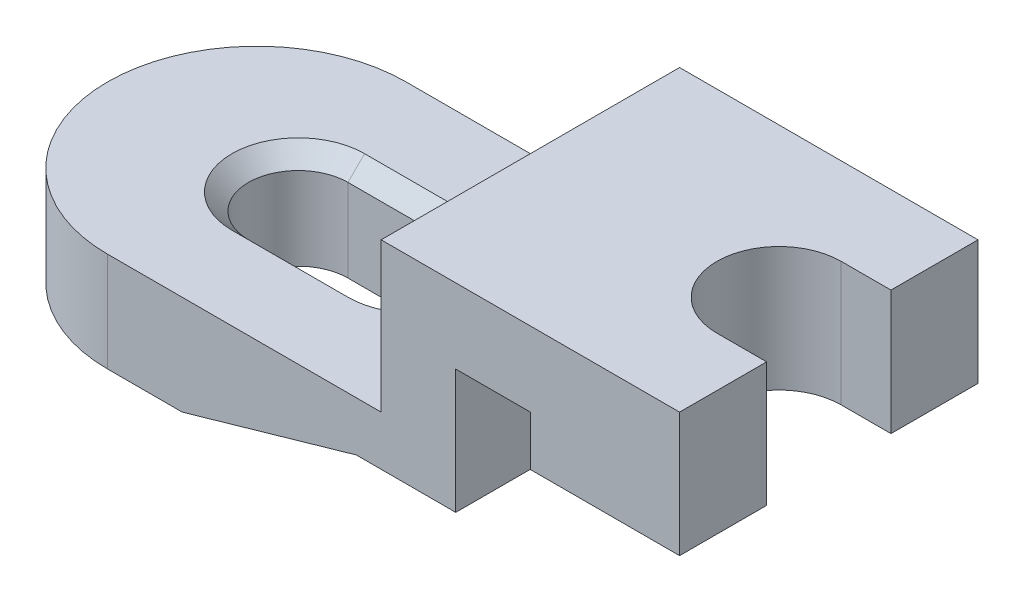
ISO-10303-21;
HEADER;
FILE_DESCRIPTION(('STEP AP214'),'2;1');
FILE_NAME('part.step','',(''),(''),'','','');
FILE_SCHEMA(('AUTOMOTIVE_DESIGN { 1 0 10303 214 1 1 1 1 }'));
ENDSEC;
DATA;
#1=APPLICATION_CONTEXT('core data for automotive mechanical design processes');
#2=APPLICATION_PROTOCOL_DEFINITION('international standard','automotive_design',2000,#1);
#3=PRODUCT_CONTEXT('',#1,'mechanical');
#4=PRODUCT('Part','Part','',(#3));
#5=PRODUCT_RELATED_PRODUCT_CATEGORY('part','',(#4));
#6=PRODUCT_DEFINITION_FORMATION('','',#4);
#7=PRODUCT_DEFINITION_CONTEXT('part definition',#1,'design');
#8=PRODUCT_DEFINITION('design','',#6,#7);
#9=PRODUCT_DEFINITION_SHAPE('','',#8);
#10=(LENGTH_UNIT() NAMED_UNIT(*) SI_UNIT(.MILLI.,.METRE.));
#11=(NAMED_UNIT(*) PLANE_ANGLE_UNIT() SI_UNIT($,.RADIAN.));
#12=(NAMED_UNIT(*) SI_UNIT($,.STERADIAN.) SOLID_ANGLE_UNIT());
#13=UNCERTAINTY_MEASURE_WITH_UNIT(LENGTH_MEASURE(1.E-05),#10,'distance_accuracy_value','');
#14=(GEOMETRIC_REPRESENTATION_CONTEXT(3) GLOBAL_UNCERTAINTY_ASSIGNED_CONTEXT((#13)) GLOBAL_UNIT_ASSIGNED_CONTEXT((#10,
#11,#12)) REPRESENTATION_CONTEXT('',''));
#15=CARTESIAN_POINT('',(0.,0.,0.));
#16=DIRECTION('',(0.,0.,1.));
#17=DIRECTION('',(1.,0.,0.));
#18=AXIS2_PLACEMENT_3D('',#15,#16,#17);
#19=CARTESIAN_POINT('',(60.,15.,18.));
#20=DIRECTION('',(-1.,0.,0.));
#21=DIRECTION('',(0.,0.,1.));
#22=AXIS2_PLACEMENT_3D('',#19,#20,#21);
#23=PLANE('',#22);
#24=DIRECTION('',(0.,0.,-1.));
#25=VECTOR('',#24,1.);
#26=CARTESIAN_POINT('',(60.,30.,18.));
#27=LINE('',#26,#25);
#28=CARTESIAN_POINT('',(60.,30.,-7.5));
#29=VERTEX_POINT('',#28);
#30=CARTESIAN_POINT('',(60.,30.,-18.));
#31=VERTEX_POINT('',#30);
#32=EDGE_CURVE('E308',#29,#31,#27,.T.);
#33=ORIENTED_EDGE('',*,*,#32,.F.);
#34=DIRECTION('',(0.,-1.,0.));
#35=VECTOR('',#34,1.);
#36=CARTESIAN_POINT('',(60.,15.,-7.5));
#37=LINE('',#36,#35);
#38=CARTESIAN_POINT('',(60.,15.,-7.5));
#39=VERTEX_POINT('',#38);
#40=EDGE_CURVE('E215',#29,#39,#37,.T.);
#41=ORIENTED_EDGE('',*,*,#40,.T.);
#42=DIRECTION('',(0.,0.,-1.));
#43=VECTOR('',#42,1.);
#44=CARTESIAN_POINT('',(60.,15.,18.));
#45=LINE('',#44,#43);
#46=CARTESIAN_POINT('',(60.,15.,-18.));
#47=VERTEX_POINT('',#46);
#48=EDGE_CURVE('E311',#39,#47,#45,.T.);
#49=ORIENTED_EDGE('',*,*,#48,.T.);
#50=DIRECTION('',(0.,1.,0.));
#51=VECTOR('',#50,1.);
#52=CARTESIAN_POINT('',(60.,15.,-18.));
#53=LINE('',#52,#51);
#54=EDGE_CURVE('E297',#47,#31,#53,.T.);
#55=ORIENTED_EDGE('',*,*,#54,.T.);
#56=EDGE_LOOP('',(#33,#41,#49,#55));
#57=FACE_BOUND('',#56,.T.);
#58=ADVANCED_FACE('F48',(#57),#23,.F.);
#59=CARTESIAN_POINT('',(24.,12.,7.99999999999999));
#60=DIRECTION('',(0.,-0.707106781186547,0.707106781186548));
#61=DIRECTION('',(-1.,0.,0.));
#62=AXIS2_PLACEMENT_3D('',#59,#60,#61);
#63=PLANE('',#62);
#64=DIRECTION('',(0.,-0.707106781186548,-0.707106781186547));
#65=VECTOR('',#64,1.);
#66=CARTESIAN_POINT('',(-3.99999999999999,12.,8.));
#67=LINE('',#66,#65);
#68=CARTESIAN_POINT('',(-3.99999999999999,12.,8.));
#69=VERTEX_POINT('',#68);
#70=CARTESIAN_POINT('',(-3.99999999999999,10.,6.));
#71=VERTEX_POINT('',#70);
#72=EDGE_CURVE('E56',#69,#71,#67,.T.);
#73=ORIENTED_EDGE('',*,*,#72,.F.);
#74=DIRECTION('',(-1.,0.,0.));
#75=VECTOR('',#74,1.);
#76=CARTESIAN_POINT('',(24.,12.,7.99999999999999));
#77=LINE('',#76,#75);
#78=CARTESIAN_POINT('',(10.,12.,8.));
#79=VERTEX_POINT('',#78);
#80=EDGE_CURVE('E356',#79,#69,#77,.T.);
#81=ORIENTED_EDGE('',*,*,#80,.F.);
#82=DIRECTION('',(0.,0.707106781186548,0.707106781186546));
#83=VECTOR('',#82,1.);
#84=CARTESIAN_POINT('',(10.,12.,7.99999999999999));
#85=LINE('',#84,#83);
#86=CARTESIAN_POINT('',(10.,10.,6.));
#87=VERTEX_POINT('',#86);
#88=EDGE_CURVE('E71',#79,#87,#85,.F.);
#89=ORIENTED_EDGE('',*,*,#88,.T.);
#90=DIRECTION('',(1.,0.,0.));
#91=VECTOR('',#90,1.);
#92=CARTESIAN_POINT('',(10.,10.,6.));
#93=LINE('',#92,#91);
#94=EDGE_CURVE('E377',#71,#87,#93,.T.);
#95=ORIENTED_EDGE('',*,*,#94,.F.);
#96=EDGE_LOOP('',(#73,#81,#89,#95));
#97=FACE_BOUND('',#96,.T.);
#98=ADVANCED_FACE('F50',(#97),#63,.F.);
#99=CARTESIAN_POINT('',(10.,12.,0.));
#100=DIRECTION('',(0.,1.,0.));
#101=DIRECTION('',(0.,0.,1.));
#102=AXIS2_PLACEMENT_3D('',#99,#100,#101);
#103=CONICAL_SURFACE('',#102,7.99999999999999,0.785398163397447);
#104=ORIENTED_EDGE('',*,*,#88,.F.);
#105=CARTESIAN_POINT('',(10.,12.,0.));
#106=DIRECTION('',(0.,-1.,0.));
#107=DIRECTION('',(1.,0.,0.));
#108=AXIS2_PLACEMENT_3D('',#105,#106,#107);
#109=CIRCLE('',#108,7.99999999999999);
#110=CARTESIAN_POINT('',(10.,12.,-8.));
#111=VERTEX_POINT('',#110);
#112=EDGE_CURVE('E359',#111,#79,#109,.T.);
#113=ORIENTED_EDGE('',*,*,#112,.F.);
#114=DIRECTION('',(0.,-0.707106781186548,0.707106781186547));
#115=VECTOR('',#114,1.);
#116=CARTESIAN_POINT('',(10.,12.,-7.99999999999999));
#117=LINE('',#116,#115);
#118=CARTESIAN_POINT('',(10.,10.,-6.));
#119=VERTEX_POINT('',#118);
#120=EDGE_CURVE('E381',#111,#119,#117,.T.);
#121=ORIENTED_EDGE('',*,*,#120,.T.);
#122=CARTESIAN_POINT('',(10.,10.,0.));
#123=DIRECTION('',(0.,-1.,0.));
#124=DIRECTION('',(0.,0.,-1.));
#125=AXIS2_PLACEMENT_3D('',#122,#123,#124);
#126=CIRCLE('',#125,6.);
#127=EDGE_CURVE('E374',#87,#119,#126,.F.);
#128=ORIENTED_EDGE('',*,*,#127,.F.);
#129=EDGE_LOOP('',(#104,#113,#121,#128));
#130=FACE_BOUND('',#129,.T.);
#131=ADVANCED_FACE('F474',(#130),#103,.F.);
#132=CARTESIAN_POINT('',(24.,12.,-8.));
#133=DIRECTION('',(0.,-0.707106781186547,-0.707106781186548));
#134=DIRECTION('',(1.,0.,0.));
#135=AXIS2_PLACEMENT_3D('',#132,#133,#134);
#136=PLANE('',#135);
#137=ORIENTED_EDGE('',*,*,#120,.F.);
#138=DIRECTION('',(1.,0.,0.));
#139=VECTOR('',#138,1.);
#140=CARTESIAN_POINT('',(24.,12.,-8.));
#141=LINE('',#140,#139);
#142=CARTESIAN_POINT('',(-3.99999999999999,12.,-7.99999999999999));
#143=VERTEX_POINT('',#142);
#144=EDGE_CURVE('E362',#143,#111,#141,.T.);
#145=ORIENTED_EDGE('',*,*,#144,.F.);
#146=DIRECTION('',(0.,0.707106781186548,-0.707106781186546));
#147=VECTOR('',#146,1.);
#148=CARTESIAN_POINT('',(-3.99999999999999,12.,-7.99999999999999));
#149=LINE('',#148,#147);
#150=CARTESIAN_POINT('',(-3.99999999999999,10.,-5.99999999999999));
#151=VERTEX_POINT('',#150);
#152=EDGE_CURVE('E379',#143,#151,#149,.F.);
#153=ORIENTED_EDGE('',*,*,#152,.T.);
#154=DIRECTION('',(-1.,0.,0.));
#155=VECTOR('',#154,1.);
#156=CARTESIAN_POINT('',(10.,10.,-6.));
#157=LINE('',#156,#155);
#158=EDGE_CURVE('E371',#119,#151,#157,.T.);
#159=ORIENTED_EDGE('',*,*,#158,.F.);
#160=EDGE_LOOP('',(#137,#145,#153,#159));
#161=FACE_BOUND('',#160,.T.);
#162=ADVANCED_FACE('F506',(#161),#136,.F.);
#163=CARTESIAN_POINT('',(-3.99999999999999,12.,0.));
#164=DIRECTION('',(0.,1.,0.));
#165=DIRECTION('',(-1.,0.,0.));
#166=AXIS2_PLACEMENT_3D('',#163,#164,#165);
#167=CONICAL_SURFACE('',#166,7.99999999999999,0.785398163397447);
#168=CARTESIAN_POINT('',(-3.99999999999999,12.,0.));
#169=DIRECTION('',(0.,-1.,0.));
#170=DIRECTION('',(1.,0.,0.));
#171=AXIS2_PLACEMENT_3D('',#168,#169,#170);
#172=CIRCLE('',#171,7.99999999999999);
#173=EDGE_CURVE('E365',#69,#143,#172,.T.);
#174=ORIENTED_EDGE('',*,*,#173,.F.);
#175=ORIENTED_EDGE('',*,*,#72,.T.);
#176=CARTESIAN_POINT('',(-3.99999999999999,9.99999999999999,0.));
#177=DIRECTION('',(0.,-1.,0.));
#178=DIRECTION('',(1.,0.,0.));
#179=AXIS2_PLACEMENT_3D('',#176,#177,#178);
#180=CIRCLE('',#179,6.);
#181=EDGE_CURVE('E368',#151,#71,#180,.F.);
#182=ORIENTED_EDGE('',*,*,#181,.F.);
#183=ORIENTED_EDGE('',*,*,#152,.F.);
#184=EDGE_LOOP('',(#174,#175,#182,#183));
#185=FACE_BOUND('',#184,.T.);
#186=ADVANCED_FACE('F386',(#185),#167,.F.);
#187=CARTESIAN_POINT('',(-8.99999999999999,12.,0.));
#188=DIRECTION('',(0.,-1.,0.));
#189=DIRECTION('',(0.,0.,-1.));
#190=AXIS2_PLACEMENT_3D('',#187,#188,#189);
#191=CYLINDRICAL_SURFACE('',#190,18.);
#192=DIRECTION('',(0.,1.,0.));
#193=VECTOR('',#192,1.);
#194=CARTESIAN_POINT('',(-8.99999999999999,12.,18.));
#195=LINE('',#194,#193);
#196=CARTESIAN_POINT('',(-8.99999999999999,12.,18.));
#197=VERTEX_POINT('',#196);
#198=CARTESIAN_POINT('',(-9.,0.,18.));
#199=VERTEX_POINT('',#198);
#200=EDGE_CURVE('E334',#197,#199,#195,.F.);
#201=ORIENTED_EDGE('',*,*,#200,.F.);
#202=CARTESIAN_POINT('',(-8.99999999999999,12.,0.));
#203=DIRECTION('',(0.,-1.,0.));
#204=DIRECTION('',(1.,0.,0.));
#205=AXIS2_PLACEMENT_3D('',#202,#203,#204);
#206=CIRCLE('',#205,18.);
#207=CARTESIAN_POINT('',(-8.99999999999999,12.,-18.));
#208=VERTEX_POINT('',#207);
#209=EDGE_CURVE('E340',#208,#197,#206,.F.);
#210=ORIENTED_EDGE('',*,*,#209,.F.);
#211=DIRECTION('',(0.,-1.,0.));
#212=VECTOR('',#211,1.);
#213=CARTESIAN_POINT('',(-8.99999999999999,0.,-18.));
#214=LINE('',#213,#212);
#215=CARTESIAN_POINT('',(-9.,0.,-18.));
#216=VERTEX_POINT('',#215);
#217=EDGE_CURVE('E337',#216,#208,#214,.F.);
#218=ORIENTED_EDGE('',*,*,#217,.F.);
#219=CARTESIAN_POINT('',(-8.99999999999999,0.,0.));
#220=DIRECTION('',(0.,1.,0.));
#221=DIRECTION('',(0.,0.,1.));
#222=AXIS2_PLACEMENT_3D('',#219,#220,#221);
#223=CIRCLE('',#222,18.);
#224=EDGE_CURVE('E342',#199,#216,#223,.F.);
#225=ORIENTED_EDGE('',*,*,#224,.F.);
#226=EDGE_LOOP('',(#201,#210,#218,#225));
#227=FACE_BOUND('',#226,.T.);
#228=ADVANCED_FACE('F413',(#227),#191,.T.);
#229=CARTESIAN_POINT('',(24.,12.,18.));
#230=DIRECTION('',(0.,-1.,0.));
#231=DIRECTION('',(1.,0.,0.));
#232=AXIS2_PLACEMENT_3D('',#229,#230,#231);
#233=PLANE('',#232);
#234=ORIENTED_EDGE('',*,*,#80,.T.);
#235=ORIENTED_EDGE('',*,*,#173,.T.);
#236=ORIENTED_EDGE('',*,*,#144,.T.);
#237=ORIENTED_EDGE('',*,*,#112,.T.);
#238=EDGE_LOOP('',(#234,#235,#236,#237));
#239=FACE_BOUND('',#238,.T.);
#240=DIRECTION('',(-1.,0.,0.));
#241=VECTOR('',#240,1.);
#242=CARTESIAN_POINT('',(24.,12.,-18.));
#243=LINE('',#242,#241);
#244=CARTESIAN_POINT('',(24.,12.,-18.));
#245=VERTEX_POINT('',#244);
#246=EDGE_CURVE('E253',#245,#208,#243,.T.);
#247=ORIENTED_EDGE('',*,*,#246,.T.);
#248=ORIENTED_EDGE('',*,*,#209,.T.);
#249=DIRECTION('',(-1.,0.,0.));
#250=VECTOR('',#249,1.);
#251=CARTESIAN_POINT('',(24.,12.,18.));
#252=LINE('',#251,#250);
#253=CARTESIAN_POINT('',(24.,12.,18.));
#254=VERTEX_POINT('',#253);
#255=EDGE_CURVE('E254',#254,#197,#252,.T.);
#256=ORIENTED_EDGE('',*,*,#255,.F.);
#257=DIRECTION('',(0.,0.,-1.));
#258=VECTOR('',#257,1.);
#259=CARTESIAN_POINT('',(24.,12.,18.));
#260=LINE('',#259,#258);
#261=EDGE_CURVE('E278',#254,#245,#260,.T.);
#262=ORIENTED_EDGE('',*,*,#261,.T.);
#263=EDGE_LOOP('',(#247,#248,#256,#262));
#264=FACE_BOUND('',#263,.T.);
#265=ADVANCED_FACE('F455',(#239,#264),#233,.F.);
#266=CARTESIAN_POINT('',(-27.,0.,18.));
#267=DIRECTION('',(0.,1.,0.));
#268=DIRECTION('',(0.,0.,1.));
#269=AXIS2_PLACEMENT_3D('',#266,#267,#268);
#270=PLANE('',#269);
#271=CARTESIAN_POINT('',(-3.99999999999999,0.,0.));
#272=DIRECTION('',(0.,1.,0.));
#273=DIRECTION('',(0.,0.,1.));
#274=AXIS2_PLACEMENT_3D('',#271,#272,#273);
#275=CIRCLE('',#274,6.);
#276=CARTESIAN_POINT('',(-3.99999999999999,0.,-5.99999999999999));
#277=VERTEX_POINT('',#276);
#278=CARTESIAN_POINT('',(-3.99999999999999,0.,6.));
#279=VERTEX_POINT('',#278);
#280=EDGE_CURVE('E353',#277,#279,#275,.T.);
#281=ORIENTED_EDGE('',*,*,#280,.T.);
#282=DIRECTION('',(1.,0.,0.));
#283=VECTOR('',#282,1.);
#284=CARTESIAN_POINT('',(-27.,0.,6.00000000000001));
#285=LINE('',#284,#283);
#286=CARTESIAN_POINT('',(0.,0.,6.));
#287=VERTEX_POINT('',#286);
#288=EDGE_CURVE('E250',#279,#287,#285,.T.);
#289=ORIENTED_EDGE('',*,*,#288,.T.);
#290=DIRECTION('',(0.,0.,-1.));
#291=VECTOR('',#290,1.);
#292=CARTESIAN_POINT('',(0.,0.,18.));
#293=LINE('',#292,#291);
#294=CARTESIAN_POINT('',(0.,0.,18.));
#295=VERTEX_POINT('',#294);
#296=EDGE_CURVE('E331',#295,#287,#293,.T.);
#297=ORIENTED_EDGE('',*,*,#296,.F.);
#298=DIRECTION('',(1.,0.,0.));
#299=VECTOR('',#298,1.);
#300=CARTESIAN_POINT('',(-27.,0.,18.));
#301=LINE('',#300,#299);
#302=EDGE_CURVE('E257',#199,#295,#301,.T.);
#303=ORIENTED_EDGE('',*,*,#302,.F.);
#304=ORIENTED_EDGE('',*,*,#224,.T.);
#305=DIRECTION('',(1.,0.,0.));
#306=VECTOR('',#305,1.);
#307=CARTESIAN_POINT('',(-27.,0.,-18.));
#308=LINE('',#307,#306);
#309=CARTESIAN_POINT('',(0.,0.,-18.));
#310=VERTEX_POINT('',#309);
#311=EDGE_CURVE('E281',#216,#310,#308,.T.);
#312=ORIENTED_EDGE('',*,*,#311,.T.);
#313=CARTESIAN_POINT('',(0.,0.,-5.99999999999999));
#314=VERTEX_POINT('',#313);
#315=EDGE_CURVE('E330',#314,#310,#293,.T.);
#316=ORIENTED_EDGE('',*,*,#315,.F.);
#317=DIRECTION('',(-1.,0.,0.));
#318=VECTOR('',#317,1.);
#319=CARTESIAN_POINT('',(-27.,0.,-5.99999999999999));
#320=LINE('',#319,#318);
#321=EDGE_CURVE('E239',#314,#277,#320,.T.);
#322=ORIENTED_EDGE('',*,*,#321,.T.);
#323=EDGE_LOOP('',(#281,#289,#297,#303,#304,#312,#316,#322));
#324=FACE_BOUND('',#323,.T.);
#325=ADVANCED_FACE('F397',(#324),#270,.F.);
#326=CARTESIAN_POINT('',(0.,0.,18.));
#327=DIRECTION('',(-0.275637355816999,0.961261695938319,0.));
#328=DIRECTION('',(-0.961261695938319,-0.275637355817,0.));
#329=AXIS2_PLACEMENT_3D('',#326,#327,#328);
#330=PLANE('',#329);
#331=ORIENTED_EDGE('',*,*,#296,.T.);
#332=DIRECTION('',(0.961261695938319,0.275637355817,0.));
#333=VECTOR('',#332,1.);
#334=CARTESIAN_POINT('',(0.,0.,6.));
#335=LINE('',#334,#333);
#336=CARTESIAN_POINT('',(10.,2.86745385758808,6.));
#337=VERTEX_POINT('',#336);
#338=EDGE_CURVE('E350',#287,#337,#335,.T.);
#339=ORIENTED_EDGE('',*,*,#338,.T.);
#340=CARTESIAN_POINT('',(10.,2.86745385758809,0.));
#341=DIRECTION('',(-0.275637355816999,0.961261695938319,0.));
#342=DIRECTION('',(0.961261695938319,0.275637355817,0.));
#343=AXIS2_PLACEMENT_3D('',#340,#341,#342);
#344=ELLIPSE('',#343,6.24179661516961,6.);
#345=CARTESIAN_POINT('',(10.,2.86745385758808,-6.));
#346=VERTEX_POINT('',#345);
#347=EDGE_CURVE('E347',#337,#346,#344,.T.);
#348=ORIENTED_EDGE('',*,*,#347,.T.);
#349=DIRECTION('',(-0.961261695938319,-0.275637355817,0.));
#350=VECTOR('',#349,1.);
#351=CARTESIAN_POINT('',(0.,0.,-5.99999999999999));
#352=LINE('',#351,#350);
#353=EDGE_CURVE('E344',#346,#314,#352,.T.);
#354=ORIENTED_EDGE('',*,*,#353,.T.);
#355=ORIENTED_EDGE('',*,*,#315,.T.);
#356=DIRECTION('',(0.961261695938319,0.275637355816999,0.));
#357=VECTOR('',#356,1.);
#358=CARTESIAN_POINT('',(0.,0.,-18.));
#359=LINE('',#358,#357);
#360=CARTESIAN_POINT('',(21.,6.02165310093498,-18.));
#361=VERTEX_POINT('',#360);
#362=EDGE_CURVE('E284',#310,#361,#359,.T.);
#363=ORIENTED_EDGE('',*,*,#362,.T.);
#364=DIRECTION('',(0.,0.,-1.));
#365=VECTOR('',#364,1.);
#366=CARTESIAN_POINT('',(21.,6.02165310093498,18.));
#367=LINE('',#366,#365);
#368=CARTESIAN_POINT('',(21.,6.02165310093498,18.));
#369=VERTEX_POINT('',#368);
#370=EDGE_CURVE('E327',#369,#361,#367,.T.);
#371=ORIENTED_EDGE('',*,*,#370,.F.);
#372=DIRECTION('',(0.961261695938319,0.275637355816999,0.));
#373=VECTOR('',#372,1.);
#374=CARTESIAN_POINT('',(0.,0.,18.));
#375=LINE('',#374,#373);
#376=EDGE_CURVE('E260',#295,#369,#375,.T.);
#377=ORIENTED_EDGE('',*,*,#376,.F.);
#378=EDGE_LOOP('',(#331,#339,#348,#354,#355,#363,#371,#377));
#379=FACE_BOUND('',#378,.T.);
#380=ADVANCED_FACE('F401',(#379),#330,.F.);
#381=CARTESIAN_POINT('',(21.,6.02165310093498,18.));
#382=DIRECTION('',(0.,1.,0.));
#383=DIRECTION('',(0.,0.,1.));
#384=AXIS2_PLACEMENT_3D('',#381,#382,#383);
#385=PLANE('',#384);
#386=DIRECTION('',(1.,0.,0.));
#387=VECTOR('',#386,1.);
#388=CARTESIAN_POINT('',(21.,6.02165310093498,-18.));
#389=LINE('',#388,#387);
#390=CARTESIAN_POINT('',(33.,6.02165310093498,-18.));
#391=VERTEX_POINT('',#390);
#392=EDGE_CURVE('E286',#361,#391,#389,.T.);
#393=ORIENTED_EDGE('',*,*,#392,.T.);
#394=DIRECTION('',(0.,0.,-1.));
#395=VECTOR('',#394,1.);
#396=CARTESIAN_POINT('',(33.,6.02165310093498,18.));
#397=LINE('',#396,#395);
#398=CARTESIAN_POINT('',(33.,6.02165310093498,18.));
#399=VERTEX_POINT('',#398);
#400=EDGE_CURVE('E324',#399,#391,#397,.T.);
#401=ORIENTED_EDGE('',*,*,#400,.F.);
#402=DIRECTION('',(1.,0.,0.));
#403=VECTOR('',#402,1.);
#404=CARTESIAN_POINT('',(21.,6.02165310093498,18.));
#405=LINE('',#404,#403);
#406=EDGE_CURVE('E262',#369,#399,#405,.T.);
#407=ORIENTED_EDGE('',*,*,#406,.F.);
#408=ORIENTED_EDGE('',*,*,#370,.T.);
#409=EDGE_LOOP('',(#393,#401,#407,#408));
#410=FACE_BOUND('',#409,.T.);
#411=ADVANCED_FACE('F420',(#410),#385,.F.);
#412=CARTESIAN_POINT('',(33.,6.02165310093498,18.));
#413=DIRECTION('',(-1.,0.,0.));
#414=DIRECTION('',(0.,0.,1.));
#415=AXIS2_PLACEMENT_3D('',#412,#413,#414);
#416=PLANE('',#415);
#417=DIRECTION('',(0.,1.,0.));
#418=VECTOR('',#417,1.);
#419=CARTESIAN_POINT('',(33.,6.02165310093498,-18.));
#420=LINE('',#419,#418);
#421=CARTESIAN_POINT('',(33.,21.,-18.));
#422=VERTEX_POINT('',#421);
#423=EDGE_CURVE('E288',#391,#422,#420,.T.);
#424=ORIENTED_EDGE('',*,*,#423,.T.);
#425=DIRECTION('',(0.,0.,-1.));
#426=VECTOR('',#425,1.);
#427=CARTESIAN_POINT('',(33.,21.,18.));
#428=LINE('',#427,#426);
#429=CARTESIAN_POINT('',(33.,21.,18.));
#430=VERTEX_POINT('',#429);
#431=EDGE_CURVE('E321',#430,#422,#428,.T.);
#432=ORIENTED_EDGE('',*,*,#431,.F.);
#433=DIRECTION('',(0.,1.,0.));
#434=VECTOR('',#433,1.);
#435=CARTESIAN_POINT('',(33.,6.02165310093498,18.));
#436=LINE('',#435,#434);
#437=EDGE_CURVE('E264',#399,#430,#436,.T.);
#438=ORIENTED_EDGE('',*,*,#437,.F.);
#439=ORIENTED_EDGE('',*,*,#400,.T.);
#440=EDGE_LOOP('',(#424,#432,#438,#439));
#441=FACE_BOUND('',#440,.T.);
#442=ADVANCED_FACE('F424',(#441),#416,.F.);
#443=CARTESIAN_POINT('',(33.,21.,18.));
#444=DIRECTION('',(0.,1.,0.));
#445=DIRECTION('',(0.,0.,1.));
#446=AXIS2_PLACEMENT_3D('',#443,#444,#445);
#447=PLANE('',#446);
#448=DIRECTION('',(1.,0.,0.));
#449=VECTOR('',#448,1.);
#450=CARTESIAN_POINT('',(33.,21.,-18.));
#451=LINE('',#450,#449);
#452=CARTESIAN_POINT('',(42.,21.,-18.));
#453=VERTEX_POINT('',#452);
#454=EDGE_CURVE('E290',#422,#453,#451,.T.);
#455=ORIENTED_EDGE('',*,*,#454,.T.);
#456=DIRECTION('',(0.,0.,-1.));
#457=VECTOR('',#456,1.);
#458=CARTESIAN_POINT('',(42.,21.,18.));
#459=LINE('',#458,#457);
#460=CARTESIAN_POINT('',(42.,21.,18.));
#461=VERTEX_POINT('',#460);
#462=EDGE_CURVE('E318',#461,#453,#459,.T.);
#463=ORIENTED_EDGE('',*,*,#462,.F.);
#464=DIRECTION('',(1.,0.,0.));
#465=VECTOR('',#464,1.);
#466=CARTESIAN_POINT('',(33.,21.,18.));
#467=LINE('',#466,#465);
#468=EDGE_CURVE('E266',#430,#461,#467,.T.);
#469=ORIENTED_EDGE('',*,*,#468,.F.);
#470=ORIENTED_EDGE('',*,*,#431,.T.);
#471=EDGE_LOOP('',(#455,#463,#469,#470));
#472=FACE_BOUND('',#471,.T.);
#473=ADVANCED_FACE('F430',(#472),#447,.F.);
#474=CARTESIAN_POINT('',(42.,21.,18.));
#475=DIRECTION('',(1.,0.,0.));
#476=DIRECTION('',(0.,0.,-1.));
#477=AXIS2_PLACEMENT_3D('',#474,#475,#476);
#478=PLANE('',#477);
#479=DIRECTION('',(0.,-1.,0.));
#480=VECTOR('',#479,1.);
#481=CARTESIAN_POINT('',(42.,21.,-18.));
#482=LINE('',#481,#480);
#483=CARTESIAN_POINT('',(42.,15.,-18.));
#484=VERTEX_POINT('',#483);
#485=EDGE_CURVE('E292',#453,#484,#482,.T.);
#486=ORIENTED_EDGE('',*,*,#485,.T.);
#487=DIRECTION('',(0.,0.,-1.));
#488=VECTOR('',#487,1.);
#489=CARTESIAN_POINT('',(42.,15.,18.));
#490=LINE('',#489,#488);
#491=CARTESIAN_POINT('',(42.,15.,18.));
#492=VERTEX_POINT('',#491);
#493=EDGE_CURVE('E315',#492,#484,#490,.T.);
#494=ORIENTED_EDGE('',*,*,#493,.F.);
#495=DIRECTION('',(0.,-1.,0.));
#496=VECTOR('',#495,1.);
#497=CARTESIAN_POINT('',(42.,21.,18.));
#498=LINE('',#497,#496);
#499=EDGE_CURVE('E268',#461,#492,#498,.T.);
#500=ORIENTED_EDGE('',*,*,#499,.F.);
#501=ORIENTED_EDGE('',*,*,#462,.T.);
#502=EDGE_LOOP('',(#486,#494,#500,#501));
#503=FACE_BOUND('',#502,.T.);
#504=ADVANCED_FACE('F434',(#503),#478,.F.);
#505=CARTESIAN_POINT('',(42.,15.,18.));
#506=DIRECTION('',(0.,1.,0.));
#507=DIRECTION('',(-1.,0.,0.));
#508=AXIS2_PLACEMENT_3D('',#505,#506,#507);
#509=PLANE('',#508);
#510=ORIENTED_EDGE('',*,*,#48,.F.);
#511=DIRECTION('',(-1.,0.,0.));
#512=VECTOR('',#511,1.);
#513=CARTESIAN_POINT('',(42.,15.,-7.5));
#514=LINE('',#513,#512);
#515=CARTESIAN_POINT('',(54.,15.,-7.5));
#516=VERTEX_POINT('',#515);
#517=EDGE_CURVE('E232',#39,#516,#514,.T.);
#518=ORIENTED_EDGE('',*,*,#517,.T.);
#519=CARTESIAN_POINT('',(54.,15.,0.));
#520=DIRECTION('',(0.,1.,0.));
#521=DIRECTION('',(-1.,0.,0.));
#522=AXIS2_PLACEMENT_3D('',#519,#520,#521);
#523=CIRCLE('',#522,7.5);
#524=CARTESIAN_POINT('',(54.,15.,7.5));
#525=VERTEX_POINT('',#524);
#526=EDGE_CURVE('E207',#516,#525,#523,.T.);
#527=ORIENTED_EDGE('',*,*,#526,.T.);
#528=DIRECTION('',(1.,0.,0.));
#529=VECTOR('',#528,1.);
#530=CARTESIAN_POINT('',(42.,15.,7.5));
#531=LINE('',#530,#529);
#532=CARTESIAN_POINT('',(60.,15.,7.5));
#533=VERTEX_POINT('',#532);
#534=EDGE_CURVE('E228',#525,#533,#531,.T.);
#535=ORIENTED_EDGE('',*,*,#534,.T.);
#536=CARTESIAN_POINT('',(60.,15.,18.));
#537=VERTEX_POINT('',#536);
#538=EDGE_CURVE('E312',#537,#533,#45,.T.);
#539=ORIENTED_EDGE('',*,*,#538,.F.);
#540=DIRECTION('',(1.,0.,0.));
#541=VECTOR('',#540,1.);
#542=CARTESIAN_POINT('',(42.,15.,18.));
#543=LINE('',#542,#541);
#544=EDGE_CURVE('E270',#492,#537,#543,.T.);
#545=ORIENTED_EDGE('',*,*,#544,.F.);
#546=ORIENTED_EDGE('',*,*,#493,.T.);
#547=DIRECTION('',(1.,0.,0.));
#548=VECTOR('',#547,1.);
#549=CARTESIAN_POINT('',(42.,15.,-18.));
#550=LINE('',#549,#548);
#551=EDGE_CURVE('E294',#484,#47,#550,.T.);
#552=ORIENTED_EDGE('',*,*,#551,.T.);
#553=EDGE_LOOP('',(#510,#518,#527,#535,#539,#545,#546,#552));
#554=FACE_BOUND('',#553,.T.);
#555=ADVANCED_FACE('F440',(#554),#509,.F.);
#556=ORIENTED_EDGE('',*,*,#538,.T.);
#557=DIRECTION('',(0.,1.,0.));
#558=VECTOR('',#557,1.);
#559=CARTESIAN_POINT('',(60.,15.,7.5));
#560=LINE('',#559,#558);
#561=CARTESIAN_POINT('',(60.,30.,7.5));
#562=VERTEX_POINT('',#561);
#563=EDGE_CURVE('E210',#533,#562,#560,.T.);
#564=ORIENTED_EDGE('',*,*,#563,.T.);
#565=CARTESIAN_POINT('',(60.,30.,18.));
#566=VERTEX_POINT('',#565);
#567=EDGE_CURVE('E309',#566,#562,#27,.T.);
#568=ORIENTED_EDGE('',*,*,#567,.F.);
#569=DIRECTION('',(0.,1.,0.));
#570=VECTOR('',#569,1.);
#571=CARTESIAN_POINT('',(60.,15.,18.));
#572=LINE('',#571,#570);
#573=EDGE_CURVE('E272',#537,#566,#572,.T.);
#574=ORIENTED_EDGE('',*,*,#573,.F.);
#575=EDGE_LOOP('',(#556,#564,#568,#574));
#576=FACE_BOUND('',#575,.T.);
#577=ADVANCED_FACE('F446',(#576),#23,.F.);
#578=CARTESIAN_POINT('',(60.,30.,18.));
#579=DIRECTION('',(0.,-1.,0.));
#580=DIRECTION('',(1.,0.,0.));
#581=AXIS2_PLACEMENT_3D('',#578,#579,#580);
#582=PLANE('',#581);
#583=CARTESIAN_POINT('',(54.,30.,0.));
#584=DIRECTION('',(0.,1.,0.));
#585=DIRECTION('',(-1.,0.,0.));
#586=AXIS2_PLACEMENT_3D('',#583,#584,#585);
#587=CIRCLE('',#586,7.5);
#588=CARTESIAN_POINT('',(54.,30.,-7.5));
#589=VERTEX_POINT('',#588);
#590=CARTESIAN_POINT('',(54.,30.,7.5));
#591=VERTEX_POINT('',#590);
#592=EDGE_CURVE('E63',#589,#591,#587,.T.);
#593=ORIENTED_EDGE('',*,*,#592,.F.);
#594=DIRECTION('',(1.,0.,0.));
#595=VECTOR('',#594,1.);
#596=CARTESIAN_POINT('',(60.,30.,-7.5));
#597=LINE('',#596,#595);
#598=EDGE_CURVE('E14',#589,#29,#597,.T.);
#599=ORIENTED_EDGE('',*,*,#598,.T.);
#600=ORIENTED_EDGE('',*,*,#32,.T.);
#601=DIRECTION('',(-1.,0.,0.));
#602=VECTOR('',#601,1.);
#603=CARTESIAN_POINT('',(60.,30.,-18.));
#604=LINE('',#603,#602);
#605=CARTESIAN_POINT('',(24.,30.,-18.));
#606=VERTEX_POINT('',#605);
#607=EDGE_CURVE('E300',#31,#606,#604,.T.);
#608=ORIENTED_EDGE('',*,*,#607,.T.);
#609=DIRECTION('',(0.,0.,-1.));
#610=VECTOR('',#609,1.);
#611=CARTESIAN_POINT('',(24.,30.,18.));
#612=LINE('',#611,#610);
#613=CARTESIAN_POINT('',(24.,30.,18.));
#614=VERTEX_POINT('',#613);
#615=EDGE_CURVE('E305',#614,#606,#612,.T.);
#616=ORIENTED_EDGE('',*,*,#615,.F.);
#617=DIRECTION('',(-1.,0.,0.));
#618=VECTOR('',#617,1.);
#619=CARTESIAN_POINT('',(60.,30.,18.));
#620=LINE('',#619,#618);
#621=EDGE_CURVE('E274',#566,#614,#620,.T.);
#622=ORIENTED_EDGE('',*,*,#621,.F.);
#623=ORIENTED_EDGE('',*,*,#567,.T.);
#624=DIRECTION('',(1.,0.,0.));
#625=VECTOR('',#624,1.);
#626=CARTESIAN_POINT('',(54.,30.,7.5));
#627=LINE('',#626,#625);
#628=EDGE_CURVE('E221',#591,#562,#627,.T.);
#629=ORIENTED_EDGE('',*,*,#628,.F.);
#630=EDGE_LOOP('',(#593,#599,#600,#608,#616,#622,#623,#629));
#631=FACE_BOUND('',#630,.T.);
#632=ADVANCED_FACE('F219',(#631),#582,.F.);
#633=CARTESIAN_POINT('',(24.,30.,18.));
#634=DIRECTION('',(1.,0.,0.));
#635=DIRECTION('',(0.,1.,0.));
#636=AXIS2_PLACEMENT_3D('',#633,#634,#635);
#637=PLANE('',#636);
#638=DIRECTION('',(0.,-1.,0.));
#639=VECTOR('',#638,1.);
#640=CARTESIAN_POINT('',(24.,30.,-18.));
#641=LINE('',#640,#639);
#642=EDGE_CURVE('E258',#606,#245,#641,.T.);
#643=ORIENTED_EDGE('',*,*,#642,.T.);
#644=ORIENTED_EDGE('',*,*,#261,.F.);
#645=DIRECTION('',(0.,-1.,0.));
#646=VECTOR('',#645,1.);
#647=CARTESIAN_POINT('',(24.,30.,18.));
#648=LINE('',#647,#646);
#649=EDGE_CURVE('E276',#614,#254,#648,.T.);
#650=ORIENTED_EDGE('',*,*,#649,.F.);
#651=ORIENTED_EDGE('',*,*,#615,.T.);
#652=EDGE_LOOP('',(#643,#644,#650,#651));
#653=FACE_BOUND('',#652,.T.);
#654=ADVANCED_FACE('F452',(#653),#637,.F.);
#655=CARTESIAN_POINT('',(0.,0.,18.));
#656=DIRECTION('',(0.,0.,1.));
#657=DIRECTION('',(1.,0.,0.));
#658=AXIS2_PLACEMENT_3D('',#655,#656,#657);
#659=PLANE('',#658);
#660=ORIENTED_EDGE('',*,*,#255,.T.);
#661=ORIENTED_EDGE('',*,*,#200,.T.);
#662=ORIENTED_EDGE('',*,*,#302,.T.);
#663=ORIENTED_EDGE('',*,*,#376,.T.);
#664=ORIENTED_EDGE('',*,*,#406,.T.);
#665=ORIENTED_EDGE('',*,*,#437,.T.);
#666=ORIENTED_EDGE('',*,*,#468,.T.);
#667=ORIENTED_EDGE('',*,*,#499,.T.);
#668=ORIENTED_EDGE('',*,*,#544,.T.);
#669=ORIENTED_EDGE('',*,*,#573,.T.);
#670=ORIENTED_EDGE('',*,*,#621,.T.);
#671=ORIENTED_EDGE('',*,*,#649,.T.);
#672=EDGE_LOOP('',(#660,#661,#662,#663,#664,#665,#666,#667,#668,#669,#670,#671));
#673=FACE_BOUND('',#672,.T.);
#674=ADVANCED_FACE('F405',(#673),#659,.T.);
#675=CARTESIAN_POINT('',(0.,0.,-18.));
#676=DIRECTION('',(0.,0.,1.));
#677=DIRECTION('',(1.,0.,0.));
#678=AXIS2_PLACEMENT_3D('',#675,#676,#677);
#679=PLANE('',#678);
#680=ORIENTED_EDGE('',*,*,#311,.F.);
#681=ORIENTED_EDGE('',*,*,#217,.T.);
#682=ORIENTED_EDGE('',*,*,#246,.F.);
#683=ORIENTED_EDGE('',*,*,#642,.F.);
#684=ORIENTED_EDGE('',*,*,#607,.F.);
#685=ORIENTED_EDGE('',*,*,#54,.F.);
#686=ORIENTED_EDGE('',*,*,#551,.F.);
#687=ORIENTED_EDGE('',*,*,#485,.F.);
#688=ORIENTED_EDGE('',*,*,#454,.F.);
#689=ORIENTED_EDGE('',*,*,#423,.F.);
#690=ORIENTED_EDGE('',*,*,#392,.F.);
#691=ORIENTED_EDGE('',*,*,#362,.F.);
#692=EDGE_LOOP('',(#680,#681,#682,#683,#684,#685,#686,#687,#688,#689,#690,#691));
#693=FACE_BOUND('',#692,.T.);
#694=ADVANCED_FACE('F416',(#693),#679,.F.);
#695=CARTESIAN_POINT('',(-3.99999999999999,-24.,0.));
#696=DIRECTION('',(0.,1.,0.));
#697=DIRECTION('',(-1.,0.,0.));
#698=AXIS2_PLACEMENT_3D('',#695,#696,#697);
#699=CYLINDRICAL_SURFACE('',#698,6.);
#700=DIRECTION('',(0.,1.,0.));
#701=VECTOR('',#700,1.);
#702=CARTESIAN_POINT('',(-3.99999999999998,-24.,-5.99999999999999));
#703=LINE('',#702,#701);
#704=EDGE_CURVE('E243',#277,#151,#703,.T.);
#705=ORIENTED_EDGE('',*,*,#704,.T.);
#706=ORIENTED_EDGE('',*,*,#181,.T.);
#707=DIRECTION('',(0.,1.,0.));
#708=VECTOR('',#707,1.);
#709=CARTESIAN_POINT('',(-3.99999999999998,-24.,6.));
#710=LINE('',#709,#708);
#711=EDGE_CURVE('E240',#279,#71,#710,.T.);
#712=ORIENTED_EDGE('',*,*,#711,.F.);
#713=ORIENTED_EDGE('',*,*,#280,.F.);
#714=EDGE_LOOP('',(#705,#706,#712,#713));
#715=FACE_BOUND('',#714,.T.);
#716=ADVANCED_FACE('F392',(#715),#699,.F.);
#717=CARTESIAN_POINT('',(10.,-24.,0.));
#718=DIRECTION('',(0.,1.,0.));
#719=DIRECTION('',(-1.,0.,0.));
#720=AXIS2_PLACEMENT_3D('',#717,#718,#719);
#721=CYLINDRICAL_SURFACE('',#720,6.);
#722=DIRECTION('',(0.,1.,0.));
#723=VECTOR('',#722,1.);
#724=CARTESIAN_POINT('',(10.,-24.,6.));
#725=LINE('',#724,#723);
#726=EDGE_CURVE('E236',#337,#87,#725,.T.);
#727=ORIENTED_EDGE('',*,*,#726,.T.);
#728=ORIENTED_EDGE('',*,*,#127,.T.);
#729=DIRECTION('',(0.,1.,0.));
#730=VECTOR('',#729,1.);
#731=CARTESIAN_POINT('',(10.,-24.,-6.));
#732=LINE('',#731,#730);
#733=EDGE_CURVE('E235',#346,#119,#732,.T.);
#734=ORIENTED_EDGE('',*,*,#733,.F.);
#735=ORIENTED_EDGE('',*,*,#347,.F.);
#736=EDGE_LOOP('',(#727,#728,#734,#735));
#737=FACE_BOUND('',#736,.T.);
#738=ADVANCED_FACE('F518',(#737),#721,.F.);
#739=CARTESIAN_POINT('',(10.,-24.,6.));
#740=DIRECTION('',(0.,0.,1.));
#741=DIRECTION('',(1.,0.,0.));
#742=AXIS2_PLACEMENT_3D('',#739,#740,#741);
#743=PLANE('',#742);
#744=ORIENTED_EDGE('',*,*,#711,.T.);
#745=ORIENTED_EDGE('',*,*,#94,.T.);
#746=ORIENTED_EDGE('',*,*,#726,.F.);
#747=ORIENTED_EDGE('',*,*,#338,.F.);
#748=ORIENTED_EDGE('',*,*,#288,.F.);
#749=EDGE_LOOP('',(#744,#745,#746,#747,#748));
#750=FACE_BOUND('',#749,.T.);
#751=ADVANCED_FACE('F394',(#750),#743,.F.);
#752=CARTESIAN_POINT('',(10.,-24.,-6.));
#753=DIRECTION('',(0.,0.,-1.));
#754=DIRECTION('',(-1.,0.,0.));
#755=AXIS2_PLACEMENT_3D('',#752,#753,#754);
#756=PLANE('',#755);
#757=ORIENTED_EDGE('',*,*,#733,.T.);
#758=ORIENTED_EDGE('',*,*,#158,.T.);
#759=ORIENTED_EDGE('',*,*,#704,.F.);
#760=ORIENTED_EDGE('',*,*,#321,.F.);
#761=ORIENTED_EDGE('',*,*,#353,.F.);
#762=EDGE_LOOP('',(#757,#758,#759,#760,#761));
#763=FACE_BOUND('',#762,.T.);
#764=ADVANCED_FACE('F520',(#763),#756,.F.);
#765=CARTESIAN_POINT('',(54.,-5.99999999999999,0.));
#766=DIRECTION('',(0.,1.,0.));
#767=DIRECTION('',(-1.,0.,0.));
#768=AXIS2_PLACEMENT_3D('',#765,#766,#767);
#769=CYLINDRICAL_SURFACE('',#768,7.5);
#770=DIRECTION('',(0.,1.,0.));
#771=VECTOR('',#770,1.);
#772=CARTESIAN_POINT('',(54.,-5.99999999999999,-7.5));
#773=LINE('',#772,#771);
#774=EDGE_CURVE('E203',#516,#589,#773,.T.);
#775=ORIENTED_EDGE('',*,*,#774,.T.);
#776=ORIENTED_EDGE('',*,*,#592,.T.);
#777=DIRECTION('',(0.,1.,0.));
#778=VECTOR('',#777,1.);
#779=CARTESIAN_POINT('',(54.,-5.99999999999999,7.5));
#780=LINE('',#779,#778);
#781=EDGE_CURVE('E211',#525,#591,#780,.T.);
#782=ORIENTED_EDGE('',*,*,#781,.F.);
#783=ORIENTED_EDGE('',*,*,#526,.F.);
#784=EDGE_LOOP('',(#775,#776,#782,#783));
#785=FACE_BOUND('',#784,.T.);
#786=ADVANCED_FACE('F205',(#785),#769,.F.);
#787=CARTESIAN_POINT('',(54.,-5.99999999999999,-7.5));
#788=DIRECTION('',(0.,0.,-1.));
#789=DIRECTION('',(-1.,0.,0.));
#790=AXIS2_PLACEMENT_3D('',#787,#788,#789);
#791=PLANE('',#790);
#792=ORIENTED_EDGE('',*,*,#40,.F.);
#793=ORIENTED_EDGE('',*,*,#598,.F.);
#794=ORIENTED_EDGE('',*,*,#774,.F.);
#795=ORIENTED_EDGE('',*,*,#517,.F.);
#796=EDGE_LOOP('',(#792,#793,#794,#795));
#797=FACE_BOUND('',#796,.T.);
#798=ADVANCED_FACE('F213',(#797),#791,.F.);
#799=CARTESIAN_POINT('',(54.,-5.99999999999999,7.5));
#800=DIRECTION('',(0.,0.,1.));
#801=DIRECTION('',(1.,0.,0.));
#802=AXIS2_PLACEMENT_3D('',#799,#800,#801);
#803=PLANE('',#802);
#804=ORIENTED_EDGE('',*,*,#781,.T.);
#805=ORIENTED_EDGE('',*,*,#628,.T.);
#806=ORIENTED_EDGE('',*,*,#563,.F.);
#807=ORIENTED_EDGE('',*,*,#534,.F.);
#808=EDGE_LOOP('',(#804,#805,#806,#807));
#809=FACE_BOUND('',#808,.T.);
#810=ADVANCED_FACE('F459',(#809),#803,.F.);
#811=CLOSED_SHELL('',(#58,#98,#131,#162,#186,#228,#265,#325,#380,#411,#442,#473,#504,#555,#577,
#632,#654,#674,#694,#716,#738,#751,#764,#786,#798,#810));
#812=MANIFOLD_SOLID_BREP('B2',#811);
#813=ADVANCED_BREP_SHAPE_REPRESENTATION('',(#18,#812),#14);
#814=SHAPE_DEFINITION_REPRESENTATION(#9,#813);
ENDSEC;
END-ISO-10303-21;
